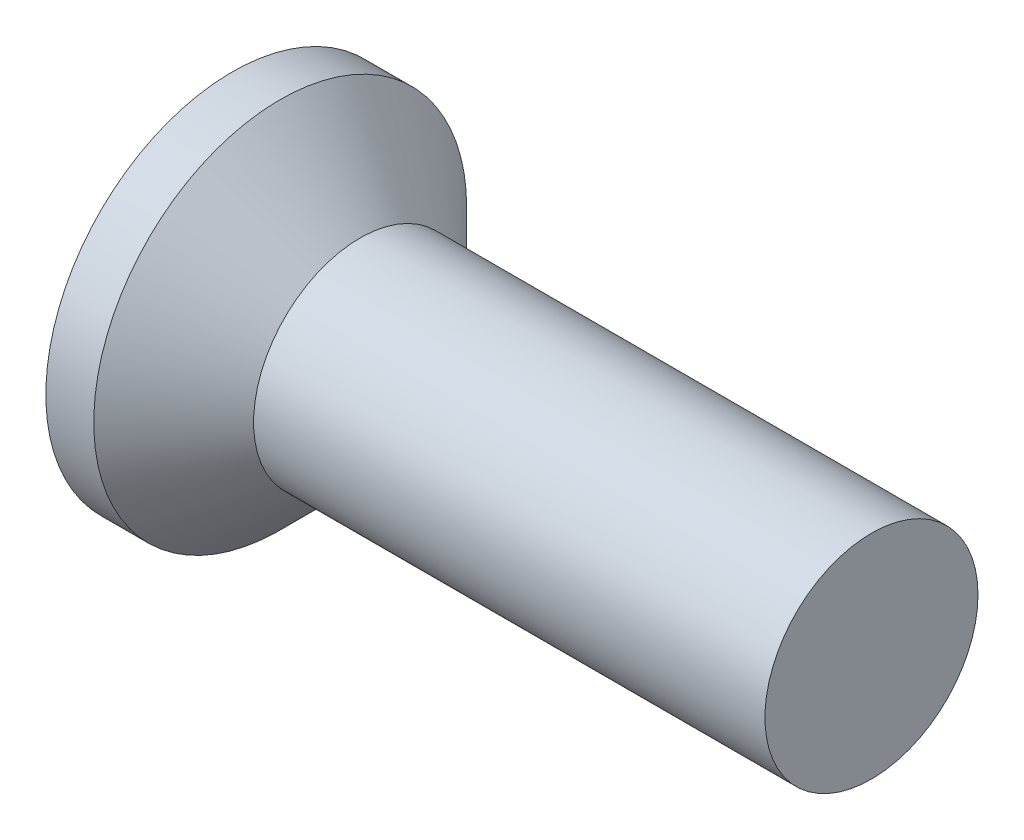
ISO-10303-21;
HEADER;
FILE_DESCRIPTION(('STEP AP214'),'2;1');
FILE_NAME('part.step','',(''),(''),'','','');
FILE_SCHEMA(('AUTOMOTIVE_DESIGN { 1 0 10303 214 1 1 1 1 }'));
ENDSEC;
DATA;
#1=APPLICATION_CONTEXT('core data for automotive mechanical design processes');
#2=APPLICATION_PROTOCOL_DEFINITION('international standard','automotive_design',2000,#1);
#3=PRODUCT_CONTEXT('',#1,'mechanical');
#4=PRODUCT('Part','Part','',(#3));
#5=PRODUCT_RELATED_PRODUCT_CATEGORY('part','',(#4));
#6=PRODUCT_DEFINITION_FORMATION('','',#4);
#7=PRODUCT_DEFINITION_CONTEXT('part definition',#1,'design');
#8=PRODUCT_DEFINITION('design','',#6,#7);
#9=PRODUCT_DEFINITION_SHAPE('','',#8);
#10=(LENGTH_UNIT() NAMED_UNIT(*) SI_UNIT(.MILLI.,.METRE.));
#11=(NAMED_UNIT(*) PLANE_ANGLE_UNIT() SI_UNIT($,.RADIAN.));
#12=(NAMED_UNIT(*) SI_UNIT($,.STERADIAN.) SOLID_ANGLE_UNIT());
#13=UNCERTAINTY_MEASURE_WITH_UNIT(LENGTH_MEASURE(1.E-05),#10,'distance_accuracy_value','');
#14=(GEOMETRIC_REPRESENTATION_CONTEXT(3) GLOBAL_UNCERTAINTY_ASSIGNED_CONTEXT((#13)) GLOBAL_UNIT_ASSIGNED_CONTEXT((#10,
#11,#12)) REPRESENTATION_CONTEXT('',''));
#15=CARTESIAN_POINT('',(0.,0.,0.));
#16=DIRECTION('',(0.,0.,1.));
#17=DIRECTION('',(1.,0.,0.));
#18=AXIS2_PLACEMENT_3D('',#15,#16,#17);
#19=CARTESIAN_POINT('',(0.,1.74999999999999,0.));
#20=DIRECTION('',(-1.,0.,0.));
#21=DIRECTION('',(0.,0.,1.));
#22=AXIS2_PLACEMENT_3D('',#19,#20,#21);
#23=PLANE('',#22);
#24=CARTESIAN_POINT('',(0.,0.,0.));
#25=DIRECTION('',(1.,0.,0.));
#26=DIRECTION('',(0.,0.,-1.));
#27=AXIS2_PLACEMENT_3D('',#24,#25,#26);
#28=CIRCLE('',#27,1.74999999999999);
#29=CARTESIAN_POINT('',(0.,0.,-1.74999999999999));
#30=VERTEX_POINT('',#29);
#31=EDGE_CURVE('E181',#30,#30,#28,.T.);
#32=ORIENTED_EDGE('',*,*,#31,.F.);
#33=EDGE_LOOP('',(#32));
#34=FACE_BOUND('',#33,.T.);
#35=DIRECTION('',(0.,1.,0.));
#36=VECTOR('',#35,1.);
#37=CARTESIAN_POINT('',(0.,-0.19,-0.19));
#38=LINE('',#37,#36);
#39=CARTESIAN_POINT('',(0.,-0.95,-0.19));
#40=VERTEX_POINT('',#39);
#41=CARTESIAN_POINT('',(0.,-0.49,-0.19));
#42=VERTEX_POINT('',#41);
#43=EDGE_CURVE('E307',#40,#42,#38,.T.);
#44=ORIENTED_EDGE('',*,*,#43,.T.);
#45=CARTESIAN_POINT('',(0.,-0.49,-0.49));
#46=DIRECTION('',(-1.,0.,0.));
#47=DIRECTION('',(0.,0.,1.));
#48=AXIS2_PLACEMENT_3D('',#45,#46,#47);
#49=CIRCLE('',#48,0.3);
#50=CARTESIAN_POINT('',(0.,-0.19,-0.49));
#51=VERTEX_POINT('',#50);
#52=EDGE_CURVE('E186',#42,#51,#49,.T.);
#53=ORIENTED_EDGE('',*,*,#52,.T.);
#54=DIRECTION('',(0.,0.,-1.));
#55=VECTOR('',#54,1.);
#56=CARTESIAN_POINT('',(0.,-0.19,-0.19));
#57=LINE('',#56,#55);
#58=CARTESIAN_POINT('',(0.,-0.19,-0.950000000000001));
#59=VERTEX_POINT('',#58);
#60=EDGE_CURVE('E309',#51,#59,#57,.T.);
#61=ORIENTED_EDGE('',*,*,#60,.T.);
#62=DIRECTION('',(0.,1.,0.));
#63=VECTOR('',#62,1.);
#64=CARTESIAN_POINT('',(0.,0.19,-0.950000000000001));
#65=LINE('',#64,#63);
#66=CARTESIAN_POINT('',(0.,0.19,-0.950000000000001));
#67=VERTEX_POINT('',#66);
#68=EDGE_CURVE('E311',#59,#67,#65,.T.);
#69=ORIENTED_EDGE('',*,*,#68,.T.);
#70=DIRECTION('',(0.,0.,1.));
#71=VECTOR('',#70,1.);
#72=CARTESIAN_POINT('',(0.,0.19,-0.19));
#73=LINE('',#72,#71);
#74=CARTESIAN_POINT('',(0.,0.19,-0.49));
#75=VERTEX_POINT('',#74);
#76=EDGE_CURVE('E314',#67,#75,#73,.T.);
#77=ORIENTED_EDGE('',*,*,#76,.T.);
#78=CARTESIAN_POINT('',(0.,0.49,-0.49));
#79=DIRECTION('',(-1.,0.,0.));
#80=DIRECTION('',(0.,0.,1.));
#81=AXIS2_PLACEMENT_3D('',#78,#79,#80);
#82=CIRCLE('',#81,0.3);
#83=CARTESIAN_POINT('',(0.,0.49,-0.19));
#84=VERTEX_POINT('',#83);
#85=EDGE_CURVE('E184',#75,#84,#82,.T.);
#86=ORIENTED_EDGE('',*,*,#85,.T.);
#87=DIRECTION('',(0.,1.,0.));
#88=VECTOR('',#87,1.);
#89=CARTESIAN_POINT('',(0.,0.19,-0.19));
#90=LINE('',#89,#88);
#91=CARTESIAN_POINT('',(0.,0.95,-0.19));
#92=VERTEX_POINT('',#91);
#93=EDGE_CURVE('E317',#84,#92,#90,.T.);
#94=ORIENTED_EDGE('',*,*,#93,.T.);
#95=DIRECTION('',(0.,0.,1.));
#96=VECTOR('',#95,1.);
#97=CARTESIAN_POINT('',(0.,0.95,-0.19));
#98=LINE('',#97,#96);
#99=CARTESIAN_POINT('',(0.,0.95,0.19));
#100=VERTEX_POINT('',#99);
#101=EDGE_CURVE('E319',#92,#100,#98,.T.);
#102=ORIENTED_EDGE('',*,*,#101,.T.);
#103=DIRECTION('',(0.,-1.,0.));
#104=VECTOR('',#103,1.);
#105=CARTESIAN_POINT('',(0.,0.19,0.19));
#106=LINE('',#105,#104);
#107=CARTESIAN_POINT('',(0.,0.49,0.19));
#108=VERTEX_POINT('',#107);
#109=EDGE_CURVE('E322',#100,#108,#106,.T.);
#110=ORIENTED_EDGE('',*,*,#109,.T.);
#111=CARTESIAN_POINT('',(0.,0.49,0.49));
#112=DIRECTION('',(-1.,0.,0.));
#113=DIRECTION('',(0.,0.,1.));
#114=AXIS2_PLACEMENT_3D('',#111,#112,#113);
#115=CIRCLE('',#114,0.3);
#116=CARTESIAN_POINT('',(0.,0.19,0.49));
#117=VERTEX_POINT('',#116);
#118=EDGE_CURVE('E149',#108,#117,#115,.T.);
#119=ORIENTED_EDGE('',*,*,#118,.T.);
#120=DIRECTION('',(0.,0.,1.));
#121=VECTOR('',#120,1.);
#122=CARTESIAN_POINT('',(0.,0.19,0.19));
#123=LINE('',#122,#121);
#124=CARTESIAN_POINT('',(0.,0.19,0.950000000000001));
#125=VERTEX_POINT('',#124);
#126=EDGE_CURVE('E143',#117,#125,#123,.T.);
#127=ORIENTED_EDGE('',*,*,#126,.T.);
#128=DIRECTION('',(0.,-1.,0.));
#129=VECTOR('',#128,1.);
#130=CARTESIAN_POINT('',(0.,0.19,0.950000000000001));
#131=LINE('',#130,#129);
#132=CARTESIAN_POINT('',(0.,-0.19,0.950000000000001));
#133=VERTEX_POINT('',#132);
#134=EDGE_CURVE('E147',#125,#133,#131,.T.);
#135=ORIENTED_EDGE('',*,*,#134,.T.);
#136=DIRECTION('',(0.,0.,-1.));
#137=VECTOR('',#136,1.);
#138=CARTESIAN_POINT('',(0.,-0.19,0.19));
#139=LINE('',#138,#137);
#140=CARTESIAN_POINT('',(0.,-0.19,0.49));
#141=VERTEX_POINT('',#140);
#142=EDGE_CURVE('E161',#133,#141,#139,.T.);
#143=ORIENTED_EDGE('',*,*,#142,.T.);
#144=CARTESIAN_POINT('',(0.,-0.49,0.49));
#145=DIRECTION('',(-1.,0.,0.));
#146=DIRECTION('',(0.,0.,1.));
#147=AXIS2_PLACEMENT_3D('',#144,#145,#146);
#148=CIRCLE('',#147,0.3);
#149=CARTESIAN_POINT('',(0.,-0.49,0.19));
#150=VERTEX_POINT('',#149);
#151=EDGE_CURVE('E180',#141,#150,#148,.T.);
#152=ORIENTED_EDGE('',*,*,#151,.T.);
#153=DIRECTION('',(0.,-1.,0.));
#154=VECTOR('',#153,1.);
#155=CARTESIAN_POINT('',(0.,-0.19,0.19));
#156=LINE('',#155,#154);
#157=CARTESIAN_POINT('',(0.,-0.95,0.189999999999999));
#158=VERTEX_POINT('',#157);
#159=EDGE_CURVE('E302',#150,#158,#156,.T.);
#160=ORIENTED_EDGE('',*,*,#159,.T.);
#161=DIRECTION('',(0.,0.,-1.));
#162=VECTOR('',#161,1.);
#163=CARTESIAN_POINT('',(0.,-0.95,-0.19));
#164=LINE('',#163,#162);
#165=EDGE_CURVE('E304',#158,#40,#164,.T.);
#166=ORIENTED_EDGE('',*,*,#165,.T.);
#167=EDGE_LOOP('',(#44,#53,#61,#69,#77,#86,#94,#102,#110,#119,#127,#135,#143,#152,#160,#166));
#168=FACE_BOUND('',#167,.T.);
#169=ADVANCED_FACE('F30',(#34,#168),#23,.T.);
#170=CARTESIAN_POINT('',(5.99999999999999,0.999999999999993,0.));
#171=DIRECTION('',(1.,0.,0.));
#172=DIRECTION('',(0.,0.,-1.));
#173=AXIS2_PLACEMENT_3D('',#170,#171,#172);
#174=PLANE('',#173);
#175=CARTESIAN_POINT('',(5.99999999999999,0.,0.));
#176=DIRECTION('',(1.,0.,0.));
#177=DIRECTION('',(0.,0.,-1.));
#178=AXIS2_PLACEMENT_3D('',#175,#176,#177);
#179=CIRCLE('',#178,0.999999999999993);
#180=CARTESIAN_POINT('',(5.99999999999999,0.,-0.999999999999993));
#181=VERTEX_POINT('',#180);
#182=EDGE_CURVE('E167',#181,#181,#179,.T.);
#183=ORIENTED_EDGE('',*,*,#182,.T.);
#184=EDGE_LOOP('',(#183));
#185=FACE_BOUND('',#184,.T.);
#186=ADVANCED_FACE('F234',(#185),#174,.T.);
#187=CARTESIAN_POINT('',(4.51581291088132,0.,0.));
#188=DIRECTION('',(1.,0.,0.));
#189=DIRECTION('',(0.,0.,-1.));
#190=AXIS2_PLACEMENT_3D('',#187,#188,#189);
#191=CYLINDRICAL_SURFACE('',#190,1.74999999999999);
#192=ORIENTED_EDGE('',*,*,#31,.T.);
#193=EDGE_LOOP('',(#192));
#194=FACE_BOUND('',#193,.T.);
#195=CARTESIAN_POINT('',(0.450000000000005,0.,0.));
#196=DIRECTION('',(1.,0.,0.));
#197=DIRECTION('',(0.,0.,-1.));
#198=AXIS2_PLACEMENT_3D('',#195,#196,#197);
#199=CIRCLE('',#198,1.74999999999999);
#200=CARTESIAN_POINT('',(0.450000000000005,0.,-1.74999999999999));
#201=VERTEX_POINT('',#200);
#202=EDGE_CURVE('E326',#201,#201,#199,.T.);
#203=ORIENTED_EDGE('',*,*,#202,.F.);
#204=EDGE_LOOP('',(#203));
#205=FACE_BOUND('',#204,.T.);
#206=ADVANCED_FACE('F240',(#194,#205),#191,.T.);
#207=CARTESIAN_POINT('',(1.2,0.,0.));
#208=DIRECTION('',(-1.,0.,0.));
#209=DIRECTION('',(0.,0.,1.));
#210=AXIS2_PLACEMENT_3D('',#207,#208,#209);
#211=CONICAL_SURFACE('',#210,0.999999999999994,0.78539816339745);
#212=ORIENTED_EDGE('',*,*,#202,.T.);
#213=EDGE_LOOP('',(#212));
#214=FACE_BOUND('',#213,.T.);
#215=CARTESIAN_POINT('',(1.2,0.,0.));
#216=DIRECTION('',(1.,0.,0.));
#217=DIRECTION('',(0.,0.,-1.));
#218=AXIS2_PLACEMENT_3D('',#215,#216,#217);
#219=CIRCLE('',#218,0.999999999999994);
#220=CARTESIAN_POINT('',(1.2,0.,-0.999999999999994));
#221=VERTEX_POINT('',#220);
#222=EDGE_CURVE('E170',#221,#221,#219,.T.);
#223=ORIENTED_EDGE('',*,*,#222,.F.);
#224=EDGE_LOOP('',(#223));
#225=FACE_BOUND('',#224,.T.);
#226=ADVANCED_FACE('F362',(#214,#225),#211,.T.);
#227=CARTESIAN_POINT('',(4.51581291088132,0.,0.));
#228=DIRECTION('',(1.,0.,0.));
#229=DIRECTION('',(0.,0.,-1.));
#230=AXIS2_PLACEMENT_3D('',#227,#228,#229);
#231=CYLINDRICAL_SURFACE('',#230,0.999999999999993);
#232=ORIENTED_EDGE('',*,*,#222,.T.);
#233=EDGE_LOOP('',(#232));
#234=FACE_BOUND('',#233,.T.);
#235=ORIENTED_EDGE('',*,*,#182,.F.);
#236=EDGE_LOOP('',(#235));
#237=FACE_BOUND('',#236,.T.);
#238=ADVANCED_FACE('F360',(#234,#237),#231,.T.);
#239=CARTESIAN_POINT('',(0.6,0.19,0.19));
#240=DIRECTION('',(0.,-1.,0.));
#241=DIRECTION('',(0.,0.,-1.));
#242=AXIS2_PLACEMENT_3D('',#239,#240,#241);
#243=PLANE('',#242);
#244=ORIENTED_EDGE('',*,*,#126,.F.);
#245=DIRECTION('',(-1.,0.,0.));
#246=VECTOR('',#245,1.);
#247=CARTESIAN_POINT('',(0.6,0.19,0.49));
#248=LINE('',#247,#246);
#249=CARTESIAN_POINT('',(0.6,0.19,0.49));
#250=VERTEX_POINT('',#249);
#251=EDGE_CURVE('E198',#117,#250,#248,.F.);
#252=ORIENTED_EDGE('',*,*,#251,.T.);
#253=DIRECTION('',(0.,0.,1.));
#254=VECTOR('',#253,1.);
#255=CARTESIAN_POINT('',(0.6,0.19,0.19));
#256=LINE('',#255,#254);
#257=CARTESIAN_POINT('',(0.6,0.19,0.603589838486225));
#258=VERTEX_POINT('',#257);
#259=EDGE_CURVE('E165',#250,#258,#256,.T.);
#260=ORIENTED_EDGE('',*,*,#259,.T.);
#261=DIRECTION('',(-0.866025403784438,0.,0.500000000000001));
#262=VECTOR('',#261,1.);
#263=CARTESIAN_POINT('',(0.,0.19,0.950000000000001));
#264=LINE('',#263,#262);
#265=EDGE_CURVE('E157',#258,#125,#264,.T.);
#266=ORIENTED_EDGE('',*,*,#265,.T.);
#267=EDGE_LOOP('',(#244,#252,#260,#266));
#268=FACE_BOUND('',#267,.T.);
#269=ADVANCED_FACE('F163',(#268),#243,.T.);
#270=CARTESIAN_POINT('',(0.,0.19,0.950000000000001));
#271=DIRECTION('',(-0.500000000000001,0.,-0.866025403784438));
#272=DIRECTION('',(-0.866025403784438,0.,0.500000000000001));
#273=AXIS2_PLACEMENT_3D('',#270,#271,#272);
#274=PLANE('',#273);
#275=ORIENTED_EDGE('',*,*,#134,.F.);
#276=ORIENTED_EDGE('',*,*,#265,.F.);
#277=DIRECTION('',(0.,-1.,0.));
#278=VECTOR('',#277,1.);
#279=CARTESIAN_POINT('',(0.6,0.19,0.603589838486225));
#280=LINE('',#279,#278);
#281=CARTESIAN_POINT('',(0.6,-0.19,0.603589838486225));
#282=VERTEX_POINT('',#281);
#283=EDGE_CURVE('E176',#258,#282,#280,.T.);
#284=ORIENTED_EDGE('',*,*,#283,.T.);
#285=DIRECTION('',(-0.866025403784438,0.,0.500000000000001));
#286=VECTOR('',#285,1.);
#287=CARTESIAN_POINT('',(0.779089653438087,-0.19,0.500192378864668));
#288=LINE('',#287,#286);
#289=EDGE_CURVE('E159',#282,#133,#288,.T.);
#290=ORIENTED_EDGE('',*,*,#289,.T.);
#291=EDGE_LOOP('',(#275,#276,#284,#290));
#292=FACE_BOUND('',#291,.T.);
#293=ADVANCED_FACE('F156',(#292),#274,.T.);
#294=CARTESIAN_POINT('',(0.6,-0.19,0.19));
#295=DIRECTION('',(0.,1.,0.));
#296=DIRECTION('',(0.,0.,1.));
#297=AXIS2_PLACEMENT_3D('',#294,#295,#296);
#298=PLANE('',#297);
#299=DIRECTION('',(0.,0.,-1.));
#300=VECTOR('',#299,1.);
#301=CARTESIAN_POINT('',(0.6,-0.19,0.19));
#302=LINE('',#301,#300);
#303=CARTESIAN_POINT('',(0.6,-0.19,0.49));
#304=VERTEX_POINT('',#303);
#305=EDGE_CURVE('E348',#282,#304,#302,.T.);
#306=ORIENTED_EDGE('',*,*,#305,.T.);
#307=DIRECTION('',(-1.,0.,0.));
#308=VECTOR('',#307,1.);
#309=CARTESIAN_POINT('',(0.6,-0.19,0.49));
#310=LINE('',#309,#308);
#311=EDGE_CURVE('E200',#304,#141,#310,.T.);
#312=ORIENTED_EDGE('',*,*,#311,.T.);
#313=ORIENTED_EDGE('',*,*,#142,.F.);
#314=ORIENTED_EDGE('',*,*,#289,.F.);
#315=EDGE_LOOP('',(#306,#312,#313,#314));
#316=FACE_BOUND('',#315,.T.);
#317=ADVANCED_FACE('F254',(#316),#298,.T.);
#318=CARTESIAN_POINT('',(0.6,-0.19,0.19));
#319=DIRECTION('',(0.,0.,-1.));
#320=DIRECTION('',(0.,1.,0.));
#321=AXIS2_PLACEMENT_3D('',#318,#319,#320);
#322=PLANE('',#321);
#323=ORIENTED_EDGE('',*,*,#159,.F.);
#324=DIRECTION('',(-1.,0.,0.));
#325=VECTOR('',#324,1.);
#326=CARTESIAN_POINT('',(0.6,-0.49,0.19));
#327=LINE('',#326,#325);
#328=CARTESIAN_POINT('',(0.6,-0.49,0.19));
#329=VERTEX_POINT('',#328);
#330=EDGE_CURVE('E45',#150,#329,#327,.F.);
#331=ORIENTED_EDGE('',*,*,#330,.T.);
#332=DIRECTION('',(0.,-1.,0.));
#333=VECTOR('',#332,1.);
#334=CARTESIAN_POINT('',(0.6,-0.19,0.19));
#335=LINE('',#334,#333);
#336=CARTESIAN_POINT('',(0.6,-0.603589838486224,0.19));
#337=VERTEX_POINT('',#336);
#338=EDGE_CURVE('E291',#329,#337,#335,.T.);
#339=ORIENTED_EDGE('',*,*,#338,.T.);
#340=DIRECTION('',(-0.866025403784438,-0.500000000000001,0.));
#341=VECTOR('',#340,1.);
#342=CARTESIAN_POINT('',(0.,-0.95,0.189999999999999));
#343=LINE('',#342,#341);
#344=EDGE_CURVE('E172',#337,#158,#343,.T.);
#345=ORIENTED_EDGE('',*,*,#344,.T.);
#346=EDGE_LOOP('',(#323,#331,#339,#345));
#347=FACE_BOUND('',#346,.T.);
#348=ADVANCED_FACE('F259',(#347),#322,.T.);
#349=CARTESIAN_POINT('',(0.,-0.95,-0.19));
#350=DIRECTION('',(-0.500000000000001,0.866025403784438,0.));
#351=DIRECTION('',(-0.866025403784438,-0.500000000000001,0.));
#352=AXIS2_PLACEMENT_3D('',#349,#350,#351);
#353=PLANE('',#352);
#354=ORIENTED_EDGE('',*,*,#165,.F.);
#355=ORIENTED_EDGE('',*,*,#344,.F.);
#356=DIRECTION('',(0.,0.,-1.));
#357=VECTOR('',#356,1.);
#358=CARTESIAN_POINT('',(0.6,-0.603589838486224,-0.19));
#359=LINE('',#358,#357);
#360=CARTESIAN_POINT('',(0.6,-0.603589838486224,-0.19));
#361=VERTEX_POINT('',#360);
#362=EDGE_CURVE('E287',#337,#361,#359,.T.);
#363=ORIENTED_EDGE('',*,*,#362,.T.);
#364=DIRECTION('',(-0.866025403784438,-0.500000000000001,0.));
#365=VECTOR('',#364,1.);
#366=CARTESIAN_POINT('',(0.779089653438087,-0.500192378864668,-0.19));
#367=LINE('',#366,#365);
#368=EDGE_CURVE('E286',#361,#40,#367,.T.);
#369=ORIENTED_EDGE('',*,*,#368,.T.);
#370=EDGE_LOOP('',(#354,#355,#363,#369));
#371=FACE_BOUND('',#370,.T.);
#372=ADVANCED_FACE('F255',(#371),#353,.T.);
#373=CARTESIAN_POINT('',(0.6,-0.19,-0.19));
#374=DIRECTION('',(0.,0.,1.));
#375=DIRECTION('',(0.,-1.,0.));
#376=AXIS2_PLACEMENT_3D('',#373,#374,#375);
#377=PLANE('',#376);
#378=DIRECTION('',(0.,1.,0.));
#379=VECTOR('',#378,1.);
#380=CARTESIAN_POINT('',(0.6,-0.19,-0.19));
#381=LINE('',#380,#379);
#382=CARTESIAN_POINT('',(0.6,-0.49,-0.19));
#383=VERTEX_POINT('',#382);
#384=EDGE_CURVE('E280',#361,#383,#381,.T.);
#385=ORIENTED_EDGE('',*,*,#384,.T.);
#386=DIRECTION('',(-1.,0.,0.));
#387=VECTOR('',#386,1.);
#388=CARTESIAN_POINT('',(0.6,-0.49,-0.19));
#389=LINE('',#388,#387);
#390=EDGE_CURVE('E177',#383,#42,#389,.T.);
#391=ORIENTED_EDGE('',*,*,#390,.T.);
#392=ORIENTED_EDGE('',*,*,#43,.F.);
#393=ORIENTED_EDGE('',*,*,#368,.F.);
#394=EDGE_LOOP('',(#385,#391,#392,#393));
#395=FACE_BOUND('',#394,.T.);
#396=ADVANCED_FACE('F258',(#395),#377,.T.);
#397=CARTESIAN_POINT('',(0.6,-0.19,-0.19));
#398=DIRECTION('',(0.,1.,0.));
#399=DIRECTION('',(0.,0.,1.));
#400=AXIS2_PLACEMENT_3D('',#397,#398,#399);
#401=PLANE('',#400);
#402=ORIENTED_EDGE('',*,*,#60,.F.);
#403=DIRECTION('',(-1.,0.,0.));
#404=VECTOR('',#403,1.);
#405=CARTESIAN_POINT('',(0.6,-0.19,-0.49));
#406=LINE('',#405,#404);
#407=CARTESIAN_POINT('',(0.6,-0.19,-0.49));
#408=VERTEX_POINT('',#407);
#409=EDGE_CURVE('E188',#51,#408,#406,.F.);
#410=ORIENTED_EDGE('',*,*,#409,.T.);
#411=DIRECTION('',(0.,0.,-1.));
#412=VECTOR('',#411,1.);
#413=CARTESIAN_POINT('',(0.6,-0.19,-0.19));
#414=LINE('',#413,#412);
#415=CARTESIAN_POINT('',(0.6,-0.19,-0.603589838486225));
#416=VERTEX_POINT('',#415);
#417=EDGE_CURVE('E282',#408,#416,#414,.T.);
#418=ORIENTED_EDGE('',*,*,#417,.T.);
#419=DIRECTION('',(-0.866025403784438,0.,-0.500000000000001));
#420=VECTOR('',#419,1.);
#421=CARTESIAN_POINT('',(0.,-0.19,-0.950000000000001));
#422=LINE('',#421,#420);
#423=EDGE_CURVE('E338',#416,#59,#422,.T.);
#424=ORIENTED_EDGE('',*,*,#423,.T.);
#425=EDGE_LOOP('',(#402,#410,#418,#424));
#426=FACE_BOUND('',#425,.T.);
#427=ADVANCED_FACE('F265',(#426),#401,.T.);
#428=CARTESIAN_POINT('',(0.,0.19,-0.950000000000001));
#429=DIRECTION('',(-0.500000000000001,0.,0.866025403784438));
#430=DIRECTION('',(0.866025403784438,0.,0.500000000000001));
#431=AXIS2_PLACEMENT_3D('',#428,#429,#430);
#432=PLANE('',#431);
#433=ORIENTED_EDGE('',*,*,#68,.F.);
#434=ORIENTED_EDGE('',*,*,#423,.F.);
#435=DIRECTION('',(0.,1.,0.));
#436=VECTOR('',#435,1.);
#437=CARTESIAN_POINT('',(0.6,0.19,-0.603589838486225));
#438=LINE('',#437,#436);
#439=CARTESIAN_POINT('',(0.6,0.19,-0.603589838486225));
#440=VERTEX_POINT('',#439);
#441=EDGE_CURVE('E289',#416,#440,#438,.T.);
#442=ORIENTED_EDGE('',*,*,#441,.T.);
#443=DIRECTION('',(-0.866025403784438,0.,-0.500000000000001));
#444=VECTOR('',#443,1.);
#445=CARTESIAN_POINT('',(0.779089653438087,0.19,-0.500192378864668));
#446=LINE('',#445,#444);
#447=EDGE_CURVE('E336',#440,#67,#446,.T.);
#448=ORIENTED_EDGE('',*,*,#447,.T.);
#449=EDGE_LOOP('',(#433,#434,#442,#448));
#450=FACE_BOUND('',#449,.T.);
#451=ADVANCED_FACE('F261',(#450),#432,.T.);
#452=CARTESIAN_POINT('',(0.6,0.19,-0.19));
#453=DIRECTION('',(0.,-1.,0.));
#454=DIRECTION('',(0.,0.,-1.));
#455=AXIS2_PLACEMENT_3D('',#452,#453,#454);
#456=PLANE('',#455);
#457=DIRECTION('',(0.,0.,1.));
#458=VECTOR('',#457,1.);
#459=CARTESIAN_POINT('',(0.6,0.19,-0.19));
#460=LINE('',#459,#458);
#461=CARTESIAN_POINT('',(0.6,0.19,-0.49));
#462=VERTEX_POINT('',#461);
#463=EDGE_CURVE('E296',#440,#462,#460,.T.);
#464=ORIENTED_EDGE('',*,*,#463,.T.);
#465=DIRECTION('',(-1.,0.,0.));
#466=VECTOR('',#465,1.);
#467=CARTESIAN_POINT('',(0.6,0.19,-0.49));
#468=LINE('',#467,#466);
#469=EDGE_CURVE('E190',#462,#75,#468,.T.);
#470=ORIENTED_EDGE('',*,*,#469,.T.);
#471=ORIENTED_EDGE('',*,*,#76,.F.);
#472=ORIENTED_EDGE('',*,*,#447,.F.);
#473=EDGE_LOOP('',(#464,#470,#471,#472));
#474=FACE_BOUND('',#473,.T.);
#475=ADVANCED_FACE('F264',(#474),#456,.T.);
#476=CARTESIAN_POINT('',(0.6,0.19,-0.19));
#477=DIRECTION('',(0.,0.,1.));
#478=DIRECTION('',(0.,-1.,0.));
#479=AXIS2_PLACEMENT_3D('',#476,#477,#478);
#480=PLANE('',#479);
#481=ORIENTED_EDGE('',*,*,#93,.F.);
#482=DIRECTION('',(-1.,0.,0.));
#483=VECTOR('',#482,1.);
#484=CARTESIAN_POINT('',(0.6,0.49,-0.19));
#485=LINE('',#484,#483);
#486=CARTESIAN_POINT('',(0.6,0.49,-0.19));
#487=VERTEX_POINT('',#486);
#488=EDGE_CURVE('E193',#84,#487,#485,.F.);
#489=ORIENTED_EDGE('',*,*,#488,.T.);
#490=DIRECTION('',(0.,1.,0.));
#491=VECTOR('',#490,1.);
#492=CARTESIAN_POINT('',(0.6,0.19,-0.19));
#493=LINE('',#492,#491);
#494=CARTESIAN_POINT('',(0.6,0.603589838486224,-0.19));
#495=VERTEX_POINT('',#494);
#496=EDGE_CURVE('E299',#487,#495,#493,.T.);
#497=ORIENTED_EDGE('',*,*,#496,.T.);
#498=DIRECTION('',(-0.866025403784438,0.500000000000001,0.));
#499=VECTOR('',#498,1.);
#500=CARTESIAN_POINT('',(0.,0.95,-0.19));
#501=LINE('',#500,#499);
#502=EDGE_CURVE('E332',#495,#92,#501,.T.);
#503=ORIENTED_EDGE('',*,*,#502,.T.);
#504=EDGE_LOOP('',(#481,#489,#497,#503));
#505=FACE_BOUND('',#504,.T.);
#506=ADVANCED_FACE('F250',(#505),#480,.T.);
#507=CARTESIAN_POINT('',(0.,0.95,-0.19));
#508=DIRECTION('',(-0.500000000000001,-0.866025403784438,0.));
#509=DIRECTION('',(0.866025403784438,-0.500000000000001,0.));
#510=AXIS2_PLACEMENT_3D('',#507,#508,#509);
#511=PLANE('',#510);
#512=ORIENTED_EDGE('',*,*,#101,.F.);
#513=ORIENTED_EDGE('',*,*,#502,.F.);
#514=DIRECTION('',(0.,0.,1.));
#515=VECTOR('',#514,1.);
#516=CARTESIAN_POINT('',(0.6,0.603589838486224,-0.19));
#517=LINE('',#516,#515);
#518=CARTESIAN_POINT('',(0.6,0.603589838486224,0.19));
#519=VERTEX_POINT('',#518);
#520=EDGE_CURVE('E220',#495,#519,#517,.T.);
#521=ORIENTED_EDGE('',*,*,#520,.T.);
#522=DIRECTION('',(-0.866025403784438,0.500000000000001,0.));
#523=VECTOR('',#522,1.);
#524=CARTESIAN_POINT('',(0.779089653438087,0.500192378864668,0.19));
#525=LINE('',#524,#523);
#526=EDGE_CURVE('E219',#519,#100,#525,.T.);
#527=ORIENTED_EDGE('',*,*,#526,.T.);
#528=EDGE_LOOP('',(#512,#513,#521,#527));
#529=FACE_BOUND('',#528,.T.);
#530=ADVANCED_FACE('F247',(#529),#511,.T.);
#531=CARTESIAN_POINT('',(0.6,0.19,0.19));
#532=DIRECTION('',(0.,0.,-1.));
#533=DIRECTION('',(0.,1.,0.));
#534=AXIS2_PLACEMENT_3D('',#531,#532,#533);
#535=PLANE('',#534);
#536=DIRECTION('',(0.,-1.,0.));
#537=VECTOR('',#536,1.);
#538=CARTESIAN_POINT('',(0.6,0.19,0.19));
#539=LINE('',#538,#537);
#540=CARTESIAN_POINT('',(0.6,0.49,0.19));
#541=VERTEX_POINT('',#540);
#542=EDGE_CURVE('E212',#519,#541,#539,.T.);
#543=ORIENTED_EDGE('',*,*,#542,.T.);
#544=DIRECTION('',(-1.,0.,0.));
#545=VECTOR('',#544,1.);
#546=CARTESIAN_POINT('',(0.6,0.49,0.19));
#547=LINE('',#546,#545);
#548=EDGE_CURVE('E195',#541,#108,#547,.T.);
#549=ORIENTED_EDGE('',*,*,#548,.T.);
#550=ORIENTED_EDGE('',*,*,#109,.F.);
#551=ORIENTED_EDGE('',*,*,#526,.F.);
#552=EDGE_LOOP('',(#543,#549,#550,#551));
#553=FACE_BOUND('',#552,.T.);
#554=ADVANCED_FACE('F217',(#553),#535,.T.);
#555=CARTESIAN_POINT('',(0.6,0.19,-0.19));
#556=DIRECTION('',(-1.,0.,0.));
#557=DIRECTION('',(0.,0.,1.));
#558=AXIS2_PLACEMENT_3D('',#555,#556,#557);
#559=PLANE('',#558);
#560=ORIENTED_EDGE('',*,*,#259,.F.);
#561=CARTESIAN_POINT('',(0.6,0.49,0.49));
#562=DIRECTION('',(-1.,0.,0.));
#563=DIRECTION('',(0.,0.,1.));
#564=AXIS2_PLACEMENT_3D('',#561,#562,#563);
#565=CIRCLE('',#564,0.3);
#566=EDGE_CURVE('E38',#250,#541,#565,.F.);
#567=ORIENTED_EDGE('',*,*,#566,.T.);
#568=ORIENTED_EDGE('',*,*,#542,.F.);
#569=ORIENTED_EDGE('',*,*,#520,.F.);
#570=ORIENTED_EDGE('',*,*,#496,.F.);
#571=CARTESIAN_POINT('',(0.6,0.49,-0.49));
#572=DIRECTION('',(-1.,0.,0.));
#573=DIRECTION('',(0.,0.,1.));
#574=AXIS2_PLACEMENT_3D('',#571,#572,#573);
#575=CIRCLE('',#574,0.3);
#576=EDGE_CURVE('E206',#487,#462,#575,.F.);
#577=ORIENTED_EDGE('',*,*,#576,.T.);
#578=ORIENTED_EDGE('',*,*,#463,.F.);
#579=ORIENTED_EDGE('',*,*,#441,.F.);
#580=ORIENTED_EDGE('',*,*,#417,.F.);
#581=CARTESIAN_POINT('',(0.6,-0.49,-0.49));
#582=DIRECTION('',(-1.,0.,0.));
#583=DIRECTION('',(0.,0.,1.));
#584=AXIS2_PLACEMENT_3D('',#581,#582,#583);
#585=CIRCLE('',#584,0.3);
#586=EDGE_CURVE('E204',#408,#383,#585,.F.);
#587=ORIENTED_EDGE('',*,*,#586,.T.);
#588=ORIENTED_EDGE('',*,*,#384,.F.);
#589=ORIENTED_EDGE('',*,*,#362,.F.);
#590=ORIENTED_EDGE('',*,*,#338,.F.);
#591=CARTESIAN_POINT('',(0.6,-0.49,0.49));
#592=DIRECTION('',(-1.,0.,0.));
#593=DIRECTION('',(0.,0.,1.));
#594=AXIS2_PLACEMENT_3D('',#591,#592,#593);
#595=CIRCLE('',#594,0.3);
#596=EDGE_CURVE('E11',#329,#304,#595,.F.);
#597=ORIENTED_EDGE('',*,*,#596,.T.);
#598=ORIENTED_EDGE('',*,*,#305,.F.);
#599=ORIENTED_EDGE('',*,*,#283,.F.);
#600=EDGE_LOOP('',(#560,#567,#568,#569,#570,#577,#578,#579,#580,#587,#588,#589,#590,#597,#598,#599));
#601=FACE_BOUND('',#600,.T.);
#602=ADVANCED_FACE('F210',(#601),#559,.T.);
#603=CARTESIAN_POINT('',(0.6,-0.49,-0.49));
#604=DIRECTION('',(-1.,0.,0.));
#605=DIRECTION('',(0.,0.,1.));
#606=AXIS2_PLACEMENT_3D('',#603,#604,#605);
#607=CYLINDRICAL_SURFACE('',#606,0.3);
#608=ORIENTED_EDGE('',*,*,#586,.F.);
#609=ORIENTED_EDGE('',*,*,#409,.F.);
#610=ORIENTED_EDGE('',*,*,#52,.F.);
#611=ORIENTED_EDGE('',*,*,#390,.F.);
#612=EDGE_LOOP('',(#608,#609,#610,#611));
#613=FACE_BOUND('',#612,.T.);
#614=ADVANCED_FACE('F230',(#613),#607,.T.);
#615=CARTESIAN_POINT('',(0.6,0.49,-0.49));
#616=DIRECTION('',(-1.,0.,0.));
#617=DIRECTION('',(0.,0.,1.));
#618=AXIS2_PLACEMENT_3D('',#615,#616,#617);
#619=CYLINDRICAL_SURFACE('',#618,0.3);
#620=ORIENTED_EDGE('',*,*,#576,.F.);
#621=ORIENTED_EDGE('',*,*,#488,.F.);
#622=ORIENTED_EDGE('',*,*,#85,.F.);
#623=ORIENTED_EDGE('',*,*,#469,.F.);
#624=EDGE_LOOP('',(#620,#621,#622,#623));
#625=FACE_BOUND('',#624,.T.);
#626=ADVANCED_FACE('F224',(#625),#619,.T.);
#627=CARTESIAN_POINT('',(0.6,0.49,0.49));
#628=DIRECTION('',(-1.,0.,0.));
#629=DIRECTION('',(0.,0.,1.));
#630=AXIS2_PLACEMENT_3D('',#627,#628,#629);
#631=CYLINDRICAL_SURFACE('',#630,0.3);
#632=ORIENTED_EDGE('',*,*,#566,.F.);
#633=ORIENTED_EDGE('',*,*,#251,.F.);
#634=ORIENTED_EDGE('',*,*,#118,.F.);
#635=ORIENTED_EDGE('',*,*,#548,.F.);
#636=EDGE_LOOP('',(#632,#633,#634,#635));
#637=FACE_BOUND('',#636,.T.);
#638=ADVANCED_FACE('F222',(#637),#631,.T.);
#639=CARTESIAN_POINT('',(0.6,-0.49,0.49));
#640=DIRECTION('',(-1.,0.,0.));
#641=DIRECTION('',(0.,0.,1.));
#642=AXIS2_PLACEMENT_3D('',#639,#640,#641);
#643=CYLINDRICAL_SURFACE('',#642,0.3);
#644=ORIENTED_EDGE('',*,*,#596,.F.);
#645=ORIENTED_EDGE('',*,*,#330,.F.);
#646=ORIENTED_EDGE('',*,*,#151,.F.);
#647=ORIENTED_EDGE('',*,*,#311,.F.);
#648=EDGE_LOOP('',(#644,#645,#646,#647));
#649=FACE_BOUND('',#648,.T.);
#650=ADVANCED_FACE('F32',(#649),#643,.T.);
#651=CLOSED_SHELL('',(#169,#186,#206,#226,#238,#269,#293,#317,#348,#372,#396,#427,#451,#475,
#506,#530,#554,#602,#614,#626,#638,#650));
#652=MANIFOLD_SOLID_BREP('B2',#651);
#653=ADVANCED_BREP_SHAPE_REPRESENTATION('',(#18,#652),#14);
#654=SHAPE_DEFINITION_REPRESENTATION(#9,#653);
ENDSEC;
END-ISO-10303-21;
